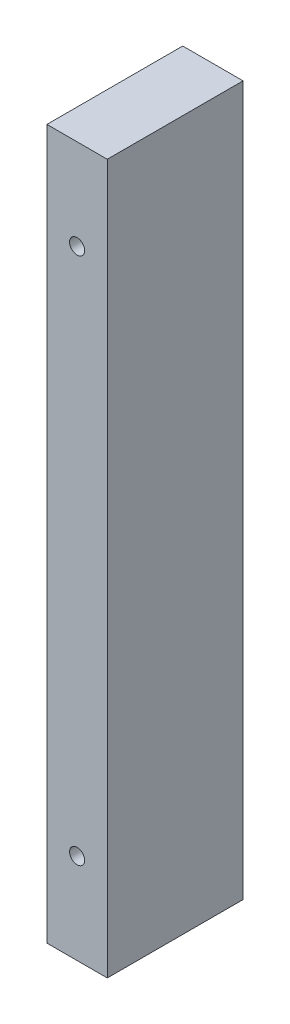
ISO-10303-21;
HEADER;
FILE_DESCRIPTION(('STEP AP214'),'2;1');
FILE_NAME('part.step','',(''),(''),'','','');
FILE_SCHEMA(('AUTOMOTIVE_DESIGN { 1 0 10303 214 1 1 1 1 }'));
ENDSEC;
DATA;
#1=APPLICATION_CONTEXT('core data for automotive mechanical design processes');
#2=APPLICATION_PROTOCOL_DEFINITION('international standard','automotive_design',2000,#1);
#3=PRODUCT_CONTEXT('',#1,'mechanical');
#4=PRODUCT('Part','Part','',(#3));
#5=PRODUCT_RELATED_PRODUCT_CATEGORY('part','',(#4));
#6=PRODUCT_DEFINITION_FORMATION('','',#4);
#7=PRODUCT_DEFINITION_CONTEXT('part definition',#1,'design');
#8=PRODUCT_DEFINITION('design','',#6,#7);
#9=PRODUCT_DEFINITION_SHAPE('','',#8);
#10=(LENGTH_UNIT() NAMED_UNIT(*) SI_UNIT(.MILLI.,.METRE.));
#11=(NAMED_UNIT(*) PLANE_ANGLE_UNIT() SI_UNIT($,.RADIAN.));
#12=(NAMED_UNIT(*) SI_UNIT($,.STERADIAN.) SOLID_ANGLE_UNIT());
#13=UNCERTAINTY_MEASURE_WITH_UNIT(LENGTH_MEASURE(1.E-05),#10,'distance_accuracy_value','');
#14=(GEOMETRIC_REPRESENTATION_CONTEXT(3) GLOBAL_UNCERTAINTY_ASSIGNED_CONTEXT((#13)) GLOBAL_UNIT_ASSIGNED_CONTEXT((#10,
#11,#12)) REPRESENTATION_CONTEXT('',''));
#15=CARTESIAN_POINT('',(0.,0.,0.));
#16=DIRECTION('',(0.,0.,1.));
#17=DIRECTION('',(1.,0.,0.));
#18=AXIS2_PLACEMENT_3D('',#15,#16,#17);
#19=CARTESIAN_POINT('',(-126.488766336441,-460.375,-28.575));
#20=DIRECTION('',(1.,0.,0.));
#21=DIRECTION('',(0.,0.,1.));
#22=AXIS2_PLACEMENT_3D('',#19,#20,#21);
#23=PLANE('',#22);
#24=DIRECTION('',(0.,-1.,0.));
#25=VECTOR('',#24,1.);
#26=CARTESIAN_POINT('',(-126.488766336441,-460.375,0.));
#27=LINE('',#26,#25);
#28=CARTESIAN_POINT('',(-126.488766336441,-311.15,0.));
#29=VERTEX_POINT('',#28);
#30=CARTESIAN_POINT('',(-126.488766336441,-460.375,0.));
#31=VERTEX_POINT('',#30);
#32=EDGE_CURVE('E115',#29,#31,#27,.T.);
#33=ORIENTED_EDGE('',*,*,#32,.F.);
#34=DIRECTION('',(0.,0.,1.));
#35=VECTOR('',#34,1.);
#36=CARTESIAN_POINT('',(-126.488766336441,-311.15,-28.575));
#37=LINE('',#36,#35);
#38=CARTESIAN_POINT('',(-126.488766336441,-311.15,-28.575));
#39=VERTEX_POINT('',#38);
#40=EDGE_CURVE('E114',#39,#29,#37,.T.);
#41=ORIENTED_EDGE('',*,*,#40,.F.);
#42=DIRECTION('',(0.,-1.,0.));
#43=VECTOR('',#42,1.);
#44=CARTESIAN_POINT('',(-126.488766336441,-460.375,-28.575));
#45=LINE('',#44,#43);
#46=CARTESIAN_POINT('',(-126.488766336441,-460.375,-28.575));
#47=VERTEX_POINT('',#46);
#48=EDGE_CURVE('E106',#39,#47,#45,.T.);
#49=ORIENTED_EDGE('',*,*,#48,.T.);
#50=DIRECTION('',(0.,0.,1.));
#51=VECTOR('',#50,1.);
#52=CARTESIAN_POINT('',(-126.488766336441,-460.375,-28.575));
#53=LINE('',#52,#51);
#54=EDGE_CURVE('E11',#47,#31,#53,.T.);
#55=ORIENTED_EDGE('',*,*,#54,.T.);
#56=EDGE_LOOP('',(#33,#41,#49,#55));
#57=FACE_BOUND('',#56,.T.);
#58=ADVANCED_FACE('F37',(#57),#23,.F.);
#59=CARTESIAN_POINT('',(-126.488766336441,-460.375,-28.575));
#60=DIRECTION('',(0.,1.,0.));
#61=DIRECTION('',(0.,0.,-1.));
#62=AXIS2_PLACEMENT_3D('',#59,#60,#61);
#63=PLANE('',#62);
#64=DIRECTION('',(1.,0.,0.));
#65=VECTOR('',#64,1.);
#66=CARTESIAN_POINT('',(-126.488766336441,-460.375,0.));
#67=LINE('',#66,#65);
#68=CARTESIAN_POINT('',(-113.788766336441,-460.375,0.));
#69=VERTEX_POINT('',#68);
#70=EDGE_CURVE('E117',#31,#69,#67,.T.);
#71=ORIENTED_EDGE('',*,*,#70,.F.);
#72=ORIENTED_EDGE('',*,*,#54,.F.);
#73=DIRECTION('',(1.,0.,0.));
#74=VECTOR('',#73,1.);
#75=CARTESIAN_POINT('',(-126.488766336441,-460.375,-28.575));
#76=LINE('',#75,#74);
#77=CARTESIAN_POINT('',(-113.788766336441,-460.375,-28.575));
#78=VERTEX_POINT('',#77);
#79=EDGE_CURVE('E81',#47,#78,#76,.T.);
#80=ORIENTED_EDGE('',*,*,#79,.T.);
#81=DIRECTION('',(0.,0.,1.));
#82=VECTOR('',#81,1.);
#83=CARTESIAN_POINT('',(-113.788766336441,-460.375,-28.575));
#84=LINE('',#83,#82);
#85=EDGE_CURVE('E46',#78,#69,#84,.T.);
#86=ORIENTED_EDGE('',*,*,#85,.T.);
#87=EDGE_LOOP('',(#71,#72,#80,#86));
#88=FACE_BOUND('',#87,.T.);
#89=ADVANCED_FACE('F149',(#88),#63,.F.);
#90=CARTESIAN_POINT('',(-113.788766336441,-460.375,-28.575));
#91=DIRECTION('',(-1.,0.,0.));
#92=DIRECTION('',(0.,0.,-1.));
#93=AXIS2_PLACEMENT_3D('',#90,#91,#92);
#94=PLANE('',#93);
#95=DIRECTION('',(0.,1.,0.));
#96=VECTOR('',#95,1.);
#97=CARTESIAN_POINT('',(-113.788766336441,-460.375,0.));
#98=LINE('',#97,#96);
#99=CARTESIAN_POINT('',(-113.788766336441,-311.15,0.));
#100=VERTEX_POINT('',#99);
#101=EDGE_CURVE('E120',#69,#100,#98,.T.);
#102=ORIENTED_EDGE('',*,*,#101,.F.);
#103=ORIENTED_EDGE('',*,*,#85,.F.);
#104=DIRECTION('',(0.,1.,0.));
#105=VECTOR('',#104,1.);
#106=CARTESIAN_POINT('',(-113.788766336441,-460.375,-28.575));
#107=LINE('',#106,#105);
#108=CARTESIAN_POINT('',(-113.788766336441,-311.15,-28.575));
#109=VERTEX_POINT('',#108);
#110=EDGE_CURVE('E110',#78,#109,#107,.T.);
#111=ORIENTED_EDGE('',*,*,#110,.T.);
#112=DIRECTION('',(0.,0.,1.));
#113=VECTOR('',#112,1.);
#114=CARTESIAN_POINT('',(-113.788766336441,-311.15,-28.575));
#115=LINE('',#114,#113);
#116=EDGE_CURVE('E124',#109,#100,#115,.T.);
#117=ORIENTED_EDGE('',*,*,#116,.T.);
#118=EDGE_LOOP('',(#102,#103,#111,#117));
#119=FACE_BOUND('',#118,.T.);
#120=ADVANCED_FACE('F154',(#119),#94,.F.);
#121=CARTESIAN_POINT('',(-126.488766336441,-311.15,-28.575));
#122=DIRECTION('',(0.,-1.,0.));
#123=DIRECTION('',(0.,0.,1.));
#124=AXIS2_PLACEMENT_3D('',#121,#122,#123);
#125=PLANE('',#124);
#126=DIRECTION('',(-1.,0.,0.));
#127=VECTOR('',#126,1.);
#128=CARTESIAN_POINT('',(-126.488766336441,-311.15,0.));
#129=LINE('',#128,#127);
#130=EDGE_CURVE('E70',#100,#29,#129,.T.);
#131=ORIENTED_EDGE('',*,*,#130,.F.);
#132=ORIENTED_EDGE('',*,*,#116,.F.);
#133=DIRECTION('',(-1.,0.,0.));
#134=VECTOR('',#133,1.);
#135=CARTESIAN_POINT('',(-126.488766336441,-311.15,-28.575));
#136=LINE('',#135,#134);
#137=EDGE_CURVE('E55',#109,#39,#136,.T.);
#138=ORIENTED_EDGE('',*,*,#137,.T.);
#139=ORIENTED_EDGE('',*,*,#40,.T.);
#140=EDGE_LOOP('',(#131,#132,#138,#139));
#141=FACE_BOUND('',#140,.T.);
#142=ADVANCED_FACE('F160',(#141),#125,.F.);
#143=CARTESIAN_POINT('',(0.,0.,-28.575));
#144=DIRECTION('',(0.,0.,1.));
#145=DIRECTION('',(-1.,0.,0.));
#146=AXIS2_PLACEMENT_3D('',#143,#144,#145);
#147=PLANE('',#146);
#148=ORIENTED_EDGE('',*,*,#48,.F.);
#149=ORIENTED_EDGE('',*,*,#137,.F.);
#150=ORIENTED_EDGE('',*,*,#110,.F.);
#151=ORIENTED_EDGE('',*,*,#79,.F.);
#152=EDGE_LOOP('',(#148,#149,#150,#151));
#153=FACE_BOUND('',#152,.T.);
#154=ADVANCED_FACE('F144',(#153),#147,.F.);
#155=CARTESIAN_POINT('',(0.,0.,0.));
#156=DIRECTION('',(0.,0.,1.));
#157=DIRECTION('',(-1.,0.,0.));
#158=AXIS2_PLACEMENT_3D('',#155,#156,#157);
#159=PLANE('',#158);
#160=CARTESIAN_POINT('',(-120.138766336441,-330.2,0.));
#161=DIRECTION('',(0.,0.,-1.));
#162=DIRECTION('',(-1.,0.,0.));
#163=AXIS2_PLACEMENT_3D('',#160,#161,#162);
#164=CIRCLE('',#163,1.58750000000001);
#165=CARTESIAN_POINT('',(-121.726266336441,-330.2,0.));
#166=VERTEX_POINT('',#165);
#167=EDGE_CURVE('E40',#166,#166,#164,.T.);
#168=ORIENTED_EDGE('',*,*,#167,.T.);
#169=EDGE_LOOP('',(#168));
#170=FACE_BOUND('',#169,.T.);
#171=CARTESIAN_POINT('',(-120.138766336441,-441.325,0.));
#172=DIRECTION('',(0.,0.,-1.));
#173=DIRECTION('',(-1.,0.,0.));
#174=AXIS2_PLACEMENT_3D('',#171,#172,#173);
#175=CIRCLE('',#174,1.58750000000001);
#176=CARTESIAN_POINT('',(-121.726266336441,-441.325,0.));
#177=VERTEX_POINT('',#176);
#178=EDGE_CURVE('E105',#177,#177,#175,.T.);
#179=ORIENTED_EDGE('',*,*,#178,.T.);
#180=EDGE_LOOP('',(#179));
#181=FACE_BOUND('',#180,.T.);
#182=ORIENTED_EDGE('',*,*,#32,.T.);
#183=ORIENTED_EDGE('',*,*,#70,.T.);
#184=ORIENTED_EDGE('',*,*,#101,.T.);
#185=ORIENTED_EDGE('',*,*,#130,.T.);
#186=EDGE_LOOP('',(#182,#183,#184,#185));
#187=FACE_BOUND('',#186,.T.);
#188=ADVANCED_FACE('F130',(#170,#181,#187),#159,.T.);
#189=CARTESIAN_POINT('',(-120.138766336441,-441.325,-12.7));
#190=DIRECTION('',(0.,0.,1.));
#191=DIRECTION('',(-1.,0.,0.));
#192=AXIS2_PLACEMENT_3D('',#189,#190,#191);
#193=CONICAL_SURFACE('',#192,1.58750000000001,1.02974425867666);
#194=CARTESIAN_POINT('',(-120.138766336441,-441.325,-13.6538662327062));
#195=VERTEX_POINT('',#194);
#196=VERTEX_LOOP('',#195);
#197=FACE_BOUND('',#196,.T.);
#198=CARTESIAN_POINT('',(-120.138766336441,-441.325,-12.7));
#199=DIRECTION('',(0.,0.,-1.));
#200=DIRECTION('',(-1.,0.,0.));
#201=AXIS2_PLACEMENT_3D('',#198,#199,#200);
#202=CIRCLE('',#201,1.58750000000001);
#203=CARTESIAN_POINT('',(-121.726266336441,-441.325,-12.7));
#204=VERTEX_POINT('',#203);
#205=EDGE_CURVE('E101',#204,#204,#202,.T.);
#206=ORIENTED_EDGE('',*,*,#205,.F.);
#207=EDGE_LOOP('',(#206));
#208=FACE_BOUND('',#207,.T.);
#209=ADVANCED_FACE('F134',(#197,#208),#193,.F.);
#210=CARTESIAN_POINT('',(-120.138766336441,-441.325,25.4));
#211=DIRECTION('',(0.,0.,1.));
#212=DIRECTION('',(-1.,0.,0.));
#213=AXIS2_PLACEMENT_3D('',#210,#211,#212);
#214=CYLINDRICAL_SURFACE('',#213,1.58750000000001);
#215=ORIENTED_EDGE('',*,*,#178,.F.);
#216=EDGE_LOOP('',(#215));
#217=FACE_BOUND('',#216,.T.);
#218=ORIENTED_EDGE('',*,*,#205,.T.);
#219=EDGE_LOOP('',(#218));
#220=FACE_BOUND('',#219,.T.);
#221=ADVANCED_FACE('F93',(#217,#220),#214,.F.);
#222=CARTESIAN_POINT('',(-120.138766336441,-330.2,-12.7));
#223=DIRECTION('',(0.,0.,1.));
#224=DIRECTION('',(-1.,0.,0.));
#225=AXIS2_PLACEMENT_3D('',#222,#223,#224);
#226=CONICAL_SURFACE('',#225,1.58750000000001,1.02974425867666);
#227=CARTESIAN_POINT('',(-120.138766336441,-330.2,-13.6538662327062));
#228=VERTEX_POINT('',#227);
#229=VERTEX_LOOP('',#228);
#230=FACE_BOUND('',#229,.T.);
#231=CARTESIAN_POINT('',(-120.138766336441,-330.2,-12.7));
#232=DIRECTION('',(0.,0.,-1.));
#233=DIRECTION('',(-1.,0.,0.));
#234=AXIS2_PLACEMENT_3D('',#231,#232,#233);
#235=CIRCLE('',#234,1.58750000000001);
#236=CARTESIAN_POINT('',(-121.726266336441,-330.2,-12.7));
#237=VERTEX_POINT('',#236);
#238=EDGE_CURVE('E97',#237,#237,#235,.T.);
#239=ORIENTED_EDGE('',*,*,#238,.F.);
#240=EDGE_LOOP('',(#239));
#241=FACE_BOUND('',#240,.T.);
#242=ADVANCED_FACE('F89',(#230,#241),#226,.F.);
#243=CARTESIAN_POINT('',(-120.138766336441,-330.2,25.4));
#244=DIRECTION('',(0.,0.,1.));
#245=DIRECTION('',(-1.,0.,0.));
#246=AXIS2_PLACEMENT_3D('',#243,#244,#245);
#247=CYLINDRICAL_SURFACE('',#246,1.58750000000001);
#248=ORIENTED_EDGE('',*,*,#167,.F.);
#249=EDGE_LOOP('',(#248));
#250=FACE_BOUND('',#249,.T.);
#251=ORIENTED_EDGE('',*,*,#238,.T.);
#252=EDGE_LOOP('',(#251));
#253=FACE_BOUND('',#252,.T.);
#254=ADVANCED_FACE('F92',(#250,#253),#247,.F.);
#255=CLOSED_SHELL('',(#58,#89,#120,#142,#154,#188,#209,#221,#242,#254));
#256=MANIFOLD_SOLID_BREP('B2',#255);
#257=ADVANCED_BREP_SHAPE_REPRESENTATION('',(#18,#256),#14);
#258=SHAPE_DEFINITION_REPRESENTATION(#9,#257);
ENDSEC;
END-ISO-10303-21;
